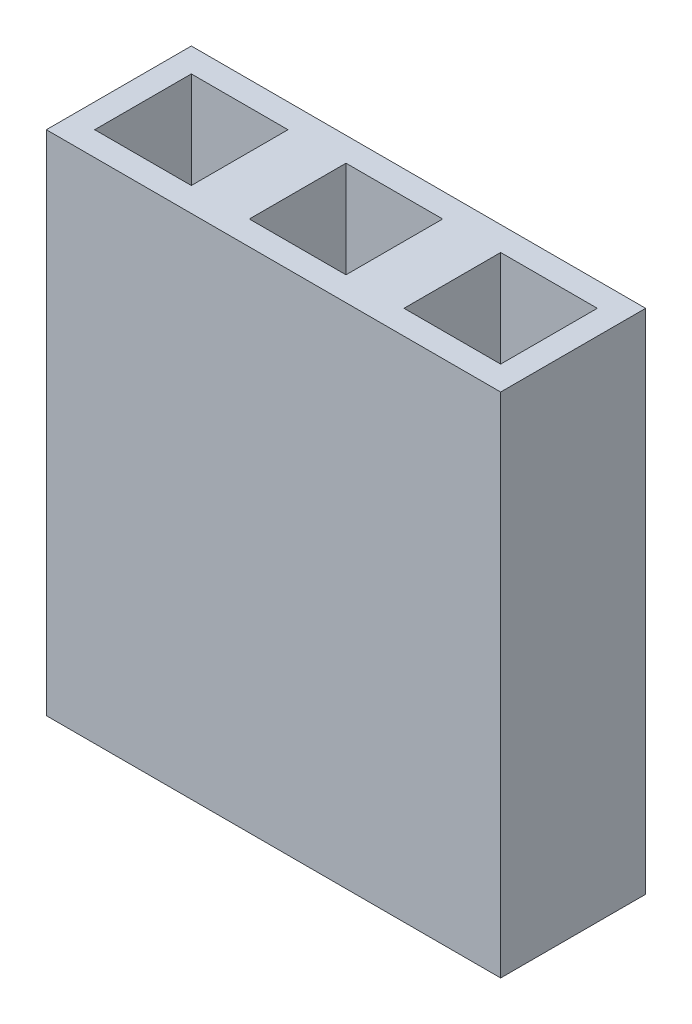
ISO-10303-21;
HEADER;
FILE_DESCRIPTION(('STEP AP214'),'2;1');
FILE_NAME('part.step','',(''),(''),'','','');
FILE_SCHEMA(('AUTOMOTIVE_DESIGN { 1 0 10303 214 1 1 1 1 }'));
ENDSEC;
DATA;
#1=APPLICATION_CONTEXT('core data for automotive mechanical design processes');
#2=APPLICATION_PROTOCOL_DEFINITION('international standard','automotive_design',2000,#1);
#3=PRODUCT_CONTEXT('',#1,'mechanical');
#4=PRODUCT('Part','Part','',(#3));
#5=PRODUCT_RELATED_PRODUCT_CATEGORY('part','',(#4));
#6=PRODUCT_DEFINITION_FORMATION('','',#4);
#7=PRODUCT_DEFINITION_CONTEXT('part definition',#1,'design');
#8=PRODUCT_DEFINITION('design','',#6,#7);
#9=PRODUCT_DEFINITION_SHAPE('','',#8);
#10=(LENGTH_UNIT() NAMED_UNIT(*) SI_UNIT(.MILLI.,.METRE.));
#11=(NAMED_UNIT(*) PLANE_ANGLE_UNIT() SI_UNIT($,.RADIAN.));
#12=(NAMED_UNIT(*) SI_UNIT($,.STERADIAN.) SOLID_ANGLE_UNIT());
#13=UNCERTAINTY_MEASURE_WITH_UNIT(LENGTH_MEASURE(1.E-05),#10,'distance_accuracy_value','');
#14=(GEOMETRIC_REPRESENTATION_CONTEXT(3) GLOBAL_UNCERTAINTY_ASSIGNED_CONTEXT((#13)) GLOBAL_UNIT_ASSIGNED_CONTEXT((#10,
#11,#12)) REPRESENTATION_CONTEXT('',''));
#15=CARTESIAN_POINT('',(0.,0.,0.));
#16=DIRECTION('',(0.,0.,1.));
#17=DIRECTION('',(1.,0.,0.));
#18=AXIS2_PLACEMENT_3D('',#15,#16,#17);
#19=CARTESIAN_POINT('',(-19.2,4.2,2.4));
#20=DIRECTION('',(0.,-1.,0.));
#21=DIRECTION('',(0.,0.,-1.));
#22=AXIS2_PLACEMENT_3D('',#19,#20,#21);
#23=PLANE('',#22);
#24=DIRECTION('',(1.,0.,0.));
#25=VECTOR('',#24,1.);
#26=CARTESIAN_POINT('',(-16.24,4.2,2.));
#27=LINE('',#26,#25);
#28=CARTESIAN_POINT('',(-16.24,4.2,2.));
#29=VERTEX_POINT('',#28);
#30=CARTESIAN_POINT('',(-14.64,4.2,2.));
#31=VERTEX_POINT('',#30);
#32=EDGE_CURVE('E226',#29,#31,#27,.T.);
#33=ORIENTED_EDGE('',*,*,#32,.F.);
#34=DIRECTION('',(0.,0.,1.));
#35=VECTOR('',#34,1.);
#36=CARTESIAN_POINT('',(-16.24,4.2,0.4));
#37=LINE('',#36,#35);
#38=CARTESIAN_POINT('',(-16.24,4.2,0.4));
#39=VERTEX_POINT('',#38);
#40=EDGE_CURVE('E57',#39,#29,#37,.T.);
#41=ORIENTED_EDGE('',*,*,#40,.F.);
#42=DIRECTION('',(-1.,0.,0.));
#43=VECTOR('',#42,1.);
#44=CARTESIAN_POINT('',(-16.24,4.2,0.4));
#45=LINE('',#44,#43);
#46=CARTESIAN_POINT('',(-14.64,4.2,0.4));
#47=VERTEX_POINT('',#46);
#48=EDGE_CURVE('E215',#47,#39,#45,.T.);
#49=ORIENTED_EDGE('',*,*,#48,.F.);
#50=DIRECTION('',(0.,0.,-1.));
#51=VECTOR('',#50,1.);
#52=CARTESIAN_POINT('',(-14.64,4.2,0.4));
#53=LINE('',#52,#51);
#54=EDGE_CURVE('E230',#31,#47,#53,.T.);
#55=ORIENTED_EDGE('',*,*,#54,.F.);
#56=EDGE_LOOP('',(#33,#41,#49,#55));
#57=FACE_BOUND('',#56,.T.);
#58=DIRECTION('',(1.,0.,0.));
#59=VECTOR('',#58,1.);
#60=CARTESIAN_POINT('',(-13.68,4.2,2.));
#61=LINE('',#60,#59);
#62=CARTESIAN_POINT('',(-13.68,4.2,2.));
#63=VERTEX_POINT('',#62);
#64=CARTESIAN_POINT('',(-12.08,4.2,2.));
#65=VERTEX_POINT('',#64);
#66=EDGE_CURVE('E258',#63,#65,#61,.T.);
#67=ORIENTED_EDGE('',*,*,#66,.F.);
#68=DIRECTION('',(0.,0.,1.));
#69=VECTOR('',#68,1.);
#70=CARTESIAN_POINT('',(-13.68,4.2,0.4));
#71=LINE('',#70,#69);
#72=CARTESIAN_POINT('',(-13.68,4.2,0.4));
#73=VERTEX_POINT('',#72);
#74=EDGE_CURVE('E208',#73,#63,#71,.T.);
#75=ORIENTED_EDGE('',*,*,#74,.F.);
#76=DIRECTION('',(-1.,0.,0.));
#77=VECTOR('',#76,1.);
#78=CARTESIAN_POINT('',(-13.68,4.2,0.4));
#79=LINE('',#78,#77);
#80=CARTESIAN_POINT('',(-12.08,4.2,0.4));
#81=VERTEX_POINT('',#80);
#82=EDGE_CURVE('E247',#81,#73,#79,.T.);
#83=ORIENTED_EDGE('',*,*,#82,.F.);
#84=DIRECTION('',(0.,0.,-1.));
#85=VECTOR('',#84,1.);
#86=CARTESIAN_POINT('',(-12.08,4.2,0.4));
#87=LINE('',#86,#85);
#88=EDGE_CURVE('E261',#65,#81,#87,.T.);
#89=ORIENTED_EDGE('',*,*,#88,.F.);
#90=EDGE_LOOP('',(#67,#75,#83,#89));
#91=FACE_BOUND('',#90,.T.);
#92=DIRECTION('',(1.,0.,0.));
#93=VECTOR('',#92,1.);
#94=CARTESIAN_POINT('',(-18.8,4.2,2.));
#95=LINE('',#94,#93);
#96=CARTESIAN_POINT('',(-18.8,4.2,2.));
#97=VERTEX_POINT('',#96);
#98=CARTESIAN_POINT('',(-17.2,4.2,2.));
#99=VERTEX_POINT('',#98);
#100=EDGE_CURVE('E287',#97,#99,#95,.T.);
#101=ORIENTED_EDGE('',*,*,#100,.F.);
#102=DIRECTION('',(0.,0.,1.));
#103=VECTOR('',#102,1.);
#104=CARTESIAN_POINT('',(-18.8,4.2,0.4));
#105=LINE('',#104,#103);
#106=CARTESIAN_POINT('',(-18.8,4.2,0.4));
#107=VERTEX_POINT('',#106);
#108=EDGE_CURVE('E237',#107,#97,#105,.T.);
#109=ORIENTED_EDGE('',*,*,#108,.F.);
#110=DIRECTION('',(-1.,0.,0.));
#111=VECTOR('',#110,1.);
#112=CARTESIAN_POINT('',(-18.8,4.2,0.4));
#113=LINE('',#112,#111);
#114=CARTESIAN_POINT('',(-17.2,4.2,0.4));
#115=VERTEX_POINT('',#114);
#116=EDGE_CURVE('E277',#115,#107,#113,.T.);
#117=ORIENTED_EDGE('',*,*,#116,.F.);
#118=DIRECTION('',(0.,0.,-1.));
#119=VECTOR('',#118,1.);
#120=CARTESIAN_POINT('',(-17.2,4.2,0.4));
#121=LINE('',#120,#119);
#122=EDGE_CURVE('E290',#99,#115,#121,.T.);
#123=ORIENTED_EDGE('',*,*,#122,.F.);
#124=EDGE_LOOP('',(#101,#109,#117,#123));
#125=FACE_BOUND('',#124,.T.);
#126=DIRECTION('',(-1.,0.,0.));
#127=VECTOR('',#126,1.);
#128=CARTESIAN_POINT('',(-19.2,4.2,2.4));
#129=LINE('',#128,#127);
#130=CARTESIAN_POINT('',(-11.68,4.2,2.4));
#131=VERTEX_POINT('',#130);
#132=CARTESIAN_POINT('',(-19.2,4.2,2.4));
#133=VERTEX_POINT('',#132);
#134=EDGE_CURVE('E156',#131,#133,#129,.T.);
#135=ORIENTED_EDGE('',*,*,#134,.F.);
#136=DIRECTION('',(0.,0.,1.));
#137=VECTOR('',#136,1.);
#138=CARTESIAN_POINT('',(-11.68,4.2,-7.6));
#139=LINE('',#138,#137);
#140=CARTESIAN_POINT('',(-11.68,4.2,0.));
#141=VERTEX_POINT('',#140);
#142=EDGE_CURVE('E145',#141,#131,#139,.T.);
#143=ORIENTED_EDGE('',*,*,#142,.F.);
#144=DIRECTION('',(-1.,0.,0.));
#145=VECTOR('',#144,1.);
#146=CARTESIAN_POINT('',(-19.2,4.2,0.));
#147=LINE('',#146,#145);
#148=CARTESIAN_POINT('',(-19.2,4.2,0.));
#149=VERTEX_POINT('',#148);
#150=EDGE_CURVE('E176',#141,#149,#147,.T.);
#151=ORIENTED_EDGE('',*,*,#150,.T.);
#152=DIRECTION('',(0.,0.,-1.));
#153=VECTOR('',#152,1.);
#154=CARTESIAN_POINT('',(-19.2,4.2,2.4));
#155=LINE('',#154,#153);
#156=EDGE_CURVE('E43',#133,#149,#155,.T.);
#157=ORIENTED_EDGE('',*,*,#156,.F.);
#158=EDGE_LOOP('',(#135,#143,#151,#157));
#159=FACE_BOUND('',#158,.T.);
#160=ADVANCED_FACE('F36',(#57,#91,#125,#159),#23,.F.);
#161=CARTESIAN_POINT('',(-19.2,4.2,2.4));
#162=DIRECTION('',(1.,0.,0.));
#163=DIRECTION('',(0.,0.,-1.));
#164=AXIS2_PLACEMENT_3D('',#161,#162,#163);
#165=PLANE('',#164);
#166=DIRECTION('',(0.,-1.,0.));
#167=VECTOR('',#166,1.);
#168=CARTESIAN_POINT('',(-19.2,4.2,0.));
#169=LINE('',#168,#167);
#170=CARTESIAN_POINT('',(-19.2,-4.2,0.));
#171=VERTEX_POINT('',#170);
#172=EDGE_CURVE('E168',#149,#171,#169,.T.);
#173=ORIENTED_EDGE('',*,*,#172,.T.);
#174=DIRECTION('',(0.,0.,-1.));
#175=VECTOR('',#174,1.);
#176=CARTESIAN_POINT('',(-19.2,-4.2,2.4));
#177=LINE('',#176,#175);
#178=CARTESIAN_POINT('',(-19.2,-4.2,2.4));
#179=VERTEX_POINT('',#178);
#180=EDGE_CURVE('E175',#179,#171,#177,.T.);
#181=ORIENTED_EDGE('',*,*,#180,.F.);
#182=DIRECTION('',(0.,-1.,0.));
#183=VECTOR('',#182,1.);
#184=CARTESIAN_POINT('',(-19.2,4.2,2.4));
#185=LINE('',#184,#183);
#186=EDGE_CURVE('E163',#133,#179,#185,.T.);
#187=ORIENTED_EDGE('',*,*,#186,.F.);
#188=ORIENTED_EDGE('',*,*,#156,.T.);
#189=EDGE_LOOP('',(#173,#181,#187,#188));
#190=FACE_BOUND('',#189,.T.);
#191=ADVANCED_FACE('F183',(#190),#165,.F.);
#192=CARTESIAN_POINT('',(-19.2,-4.2,2.4));
#193=DIRECTION('',(0.,1.,0.));
#194=DIRECTION('',(0.,0.,1.));
#195=AXIS2_PLACEMENT_3D('',#192,#193,#194);
#196=PLANE('',#195);
#197=CARTESIAN_POINT('',(-15.457,-4.2,1.2));
#198=DIRECTION('',(0.,1.,0.));
#199=DIRECTION('',(0.,0.,1.));
#200=AXIS2_PLACEMENT_3D('',#197,#198,#199);
#201=CIRCLE('',#200,0.509999999999999);
#202=CARTESIAN_POINT('',(-15.457,-4.2,1.71));
#203=VERTEX_POINT('',#202);
#204=EDGE_CURVE('E196',#203,#203,#201,.T.);
#205=ORIENTED_EDGE('',*,*,#204,.T.);
#206=EDGE_LOOP('',(#205));
#207=FACE_BOUND('',#206,.T.);
#208=CARTESIAN_POINT('',(-12.914,-4.2,1.2));
#209=DIRECTION('',(0.,1.,0.));
#210=DIRECTION('',(0.,0.,1.));
#211=AXIS2_PLACEMENT_3D('',#208,#209,#210);
#212=CIRCLE('',#211,0.509999999999999);
#213=CARTESIAN_POINT('',(-12.914,-4.2,1.71));
#214=VERTEX_POINT('',#213);
#215=EDGE_CURVE('E193',#214,#214,#212,.T.);
#216=ORIENTED_EDGE('',*,*,#215,.T.);
#217=EDGE_LOOP('',(#216));
#218=FACE_BOUND('',#217,.T.);
#219=CARTESIAN_POINT('',(-18.,-4.2,1.2));
#220=DIRECTION('',(0.,1.,0.));
#221=DIRECTION('',(0.,0.,1.));
#222=AXIS2_PLACEMENT_3D('',#219,#220,#221);
#223=CIRCLE('',#222,0.509999999999999);
#224=CARTESIAN_POINT('',(-18.,-4.2,1.71));
#225=VERTEX_POINT('',#224);
#226=EDGE_CURVE('E205',#225,#225,#223,.T.);
#227=ORIENTED_EDGE('',*,*,#226,.T.);
#228=EDGE_LOOP('',(#227));
#229=FACE_BOUND('',#228,.T.);
#230=DIRECTION('',(1.,0.,0.));
#231=VECTOR('',#230,1.);
#232=CARTESIAN_POINT('',(-19.2,-4.2,0.));
#233=LINE('',#232,#231);
#234=CARTESIAN_POINT('',(-11.68,-4.2,0.));
#235=VERTEX_POINT('',#234);
#236=EDGE_CURVE('E164',#171,#235,#233,.T.);
#237=ORIENTED_EDGE('',*,*,#236,.T.);
#238=DIRECTION('',(0.,0.,1.));
#239=VECTOR('',#238,1.);
#240=CARTESIAN_POINT('',(-11.68,-4.2,-7.6));
#241=LINE('',#240,#239);
#242=CARTESIAN_POINT('',(-11.68,-4.2,2.4));
#243=VERTEX_POINT('',#242);
#244=EDGE_CURVE('E50',#235,#243,#241,.T.);
#245=ORIENTED_EDGE('',*,*,#244,.T.);
#246=DIRECTION('',(1.,0.,0.));
#247=VECTOR('',#246,1.);
#248=CARTESIAN_POINT('',(-19.2,-4.2,2.4));
#249=LINE('',#248,#247);
#250=EDGE_CURVE('E159',#179,#243,#249,.T.);
#251=ORIENTED_EDGE('',*,*,#250,.F.);
#252=ORIENTED_EDGE('',*,*,#180,.T.);
#253=EDGE_LOOP('',(#237,#245,#251,#252));
#254=FACE_BOUND('',#253,.T.);
#255=ADVANCED_FACE('F189',(#207,#218,#229,#254),#196,.F.);
#256=CARTESIAN_POINT('',(0.,0.,2.4));
#257=DIRECTION('',(0.,0.,1.));
#258=DIRECTION('',(1.,0.,0.));
#259=AXIS2_PLACEMENT_3D('',#256,#257,#258);
#260=PLANE('',#259);
#261=DIRECTION('',(0.,-1.,0.));
#262=VECTOR('',#261,1.);
#263=CARTESIAN_POINT('',(-11.68,4.2,2.4));
#264=LINE('',#263,#262);
#265=EDGE_CURVE('E148',#131,#243,#264,.T.);
#266=ORIENTED_EDGE('',*,*,#265,.F.);
#267=ORIENTED_EDGE('',*,*,#134,.T.);
#268=ORIENTED_EDGE('',*,*,#186,.T.);
#269=ORIENTED_EDGE('',*,*,#250,.T.);
#270=EDGE_LOOP('',(#266,#267,#268,#269));
#271=FACE_BOUND('',#270,.T.);
#272=ADVANCED_FACE('F155',(#271),#260,.T.);
#273=CARTESIAN_POINT('',(0.,0.,0.));
#274=DIRECTION('',(0.,0.,1.));
#275=DIRECTION('',(1.,0.,0.));
#276=AXIS2_PLACEMENT_3D('',#273,#274,#275);
#277=PLANE('',#276);
#278=ORIENTED_EDGE('',*,*,#150,.F.);
#279=DIRECTION('',(0.,-1.,0.));
#280=VECTOR('',#279,1.);
#281=CARTESIAN_POINT('',(-11.68,0.,0.));
#282=LINE('',#281,#280);
#283=EDGE_CURVE('E11',#141,#235,#282,.T.);
#284=ORIENTED_EDGE('',*,*,#283,.T.);
#285=ORIENTED_EDGE('',*,*,#236,.F.);
#286=ORIENTED_EDGE('',*,*,#172,.F.);
#287=EDGE_LOOP('',(#278,#284,#285,#286));
#288=FACE_BOUND('',#287,.T.);
#289=ADVANCED_FACE('F187',(#288),#277,.F.);
#290=CARTESIAN_POINT('',(-18.8,1.7,0.4));
#291=DIRECTION('',(-1.,0.,0.));
#292=DIRECTION('',(0.,0.,1.));
#293=AXIS2_PLACEMENT_3D('',#290,#291,#292);
#294=PLANE('',#293);
#295=ORIENTED_EDGE('',*,*,#108,.T.);
#296=DIRECTION('',(0.,1.,0.));
#297=VECTOR('',#296,1.);
#298=CARTESIAN_POINT('',(-18.8,1.7,2.));
#299=LINE('',#298,#297);
#300=CARTESIAN_POINT('',(-18.8,1.7,2.));
#301=VERTEX_POINT('',#300);
#302=EDGE_CURVE('E171',#301,#97,#299,.T.);
#303=ORIENTED_EDGE('',*,*,#302,.F.);
#304=DIRECTION('',(0.,0.,1.));
#305=VECTOR('',#304,1.);
#306=CARTESIAN_POINT('',(-18.8,1.7,0.4));
#307=LINE('',#306,#305);
#308=CARTESIAN_POINT('',(-18.8,1.7,0.4));
#309=VERTEX_POINT('',#308);
#310=EDGE_CURVE('E273',#309,#301,#307,.T.);
#311=ORIENTED_EDGE('',*,*,#310,.F.);
#312=DIRECTION('',(0.,1.,0.));
#313=VECTOR('',#312,1.);
#314=CARTESIAN_POINT('',(-18.8,1.7,0.4));
#315=LINE('',#314,#313);
#316=EDGE_CURVE('E178',#309,#107,#315,.T.);
#317=ORIENTED_EDGE('',*,*,#316,.T.);
#318=EDGE_LOOP('',(#295,#303,#311,#317));
#319=FACE_BOUND('',#318,.T.);
#320=ADVANCED_FACE('F317',(#319),#294,.F.);
#321=CARTESIAN_POINT('',(-18.8,1.7,0.4));
#322=DIRECTION('',(0.,0.,-1.));
#323=DIRECTION('',(-1.,0.,0.));
#324=AXIS2_PLACEMENT_3D('',#321,#322,#323);
#325=PLANE('',#324);
#326=ORIENTED_EDGE('',*,*,#116,.T.);
#327=ORIENTED_EDGE('',*,*,#316,.F.);
#328=DIRECTION('',(-1.,0.,0.));
#329=VECTOR('',#328,1.);
#330=CARTESIAN_POINT('',(-18.8,1.7,0.4));
#331=LINE('',#330,#329);
#332=CARTESIAN_POINT('',(-17.2,1.7,0.4));
#333=VERTEX_POINT('',#332);
#334=EDGE_CURVE('E283',#333,#309,#331,.T.);
#335=ORIENTED_EDGE('',*,*,#334,.F.);
#336=DIRECTION('',(0.,1.,0.));
#337=VECTOR('',#336,1.);
#338=CARTESIAN_POINT('',(-17.2,1.7,0.4));
#339=LINE('',#338,#337);
#340=EDGE_CURVE('E296',#333,#115,#339,.T.);
#341=ORIENTED_EDGE('',*,*,#340,.T.);
#342=EDGE_LOOP('',(#326,#327,#335,#341));
#343=FACE_BOUND('',#342,.T.);
#344=ADVANCED_FACE('F316',(#343),#325,.F.);
#345=CARTESIAN_POINT('',(-17.2,1.7,0.4));
#346=DIRECTION('',(1.,0.,0.));
#347=DIRECTION('',(0.,0.,-1.));
#348=AXIS2_PLACEMENT_3D('',#345,#346,#347);
#349=PLANE('',#348);
#350=ORIENTED_EDGE('',*,*,#122,.T.);
#351=ORIENTED_EDGE('',*,*,#340,.F.);
#352=DIRECTION('',(0.,0.,-1.));
#353=VECTOR('',#352,1.);
#354=CARTESIAN_POINT('',(-17.2,1.7,0.4));
#355=LINE('',#354,#353);
#356=CARTESIAN_POINT('',(-17.2,1.7,2.));
#357=VERTEX_POINT('',#356);
#358=EDGE_CURVE('E280',#357,#333,#355,.T.);
#359=ORIENTED_EDGE('',*,*,#358,.F.);
#360=DIRECTION('',(0.,1.,0.));
#361=VECTOR('',#360,1.);
#362=CARTESIAN_POINT('',(-17.2,1.7,2.));
#363=LINE('',#362,#361);
#364=EDGE_CURVE('E297',#357,#99,#363,.T.);
#365=ORIENTED_EDGE('',*,*,#364,.T.);
#366=EDGE_LOOP('',(#350,#351,#359,#365));
#367=FACE_BOUND('',#366,.T.);
#368=ADVANCED_FACE('F311',(#367),#349,.F.);
#369=CARTESIAN_POINT('',(-18.8,1.7,2.));
#370=DIRECTION('',(0.,0.,1.));
#371=DIRECTION('',(1.,0.,0.));
#372=AXIS2_PLACEMENT_3D('',#369,#370,#371);
#373=PLANE('',#372);
#374=ORIENTED_EDGE('',*,*,#100,.T.);
#375=ORIENTED_EDGE('',*,*,#364,.F.);
#376=DIRECTION('',(1.,0.,0.));
#377=VECTOR('',#376,1.);
#378=CARTESIAN_POINT('',(-18.8,1.7,2.));
#379=LINE('',#378,#377);
#380=EDGE_CURVE('E276',#301,#357,#379,.T.);
#381=ORIENTED_EDGE('',*,*,#380,.F.);
#382=ORIENTED_EDGE('',*,*,#302,.T.);
#383=EDGE_LOOP('',(#374,#375,#381,#382));
#384=FACE_BOUND('',#383,.T.);
#385=ADVANCED_FACE('F304',(#384),#373,.F.);
#386=CARTESIAN_POINT('',(0.,1.7,0.));
#387=DIRECTION('',(0.,1.,0.));
#388=DIRECTION('',(0.,0.,1.));
#389=AXIS2_PLACEMENT_3D('',#386,#387,#388);
#390=PLANE('',#389);
#391=CARTESIAN_POINT('',(-18.,1.7,1.2));
#392=DIRECTION('',(0.,1.,0.));
#393=DIRECTION('',(0.,0.,1.));
#394=AXIS2_PLACEMENT_3D('',#391,#392,#393);
#395=CIRCLE('',#394,0.509999999999999);
#396=CARTESIAN_POINT('',(-18.,1.7,1.71));
#397=VERTEX_POINT('',#396);
#398=EDGE_CURVE('E199',#397,#397,#395,.T.);
#399=ORIENTED_EDGE('',*,*,#398,.F.);
#400=EDGE_LOOP('',(#399));
#401=FACE_BOUND('',#400,.T.);
#402=ORIENTED_EDGE('',*,*,#310,.T.);
#403=ORIENTED_EDGE('',*,*,#380,.T.);
#404=ORIENTED_EDGE('',*,*,#358,.T.);
#405=ORIENTED_EDGE('',*,*,#334,.T.);
#406=EDGE_LOOP('',(#402,#403,#404,#405));
#407=FACE_BOUND('',#406,.T.);
#408=ADVANCED_FACE('F315',(#401,#407),#390,.T.);
#409=CARTESIAN_POINT('',(-13.68,1.7,0.4));
#410=DIRECTION('',(-1.,0.,0.));
#411=DIRECTION('',(0.,0.,1.));
#412=AXIS2_PLACEMENT_3D('',#409,#410,#411);
#413=PLANE('',#412);
#414=ORIENTED_EDGE('',*,*,#74,.T.);
#415=DIRECTION('',(0.,1.,0.));
#416=VECTOR('',#415,1.);
#417=CARTESIAN_POINT('',(-13.68,1.7,2.));
#418=LINE('',#417,#416);
#419=CARTESIAN_POINT('',(-13.68,1.7,2.));
#420=VERTEX_POINT('',#419);
#421=EDGE_CURVE('E256',#420,#63,#418,.T.);
#422=ORIENTED_EDGE('',*,*,#421,.F.);
#423=DIRECTION('',(0.,0.,1.));
#424=VECTOR('',#423,1.);
#425=CARTESIAN_POINT('',(-13.68,1.7,0.4));
#426=LINE('',#425,#424);
#427=CARTESIAN_POINT('',(-13.68,1.7,0.4));
#428=VERTEX_POINT('',#427);
#429=EDGE_CURVE('E243',#428,#420,#426,.T.);
#430=ORIENTED_EDGE('',*,*,#429,.F.);
#431=DIRECTION('',(0.,1.,0.));
#432=VECTOR('',#431,1.);
#433=CARTESIAN_POINT('',(-13.68,1.7,0.4));
#434=LINE('',#433,#432);
#435=EDGE_CURVE('E227',#428,#73,#434,.T.);
#436=ORIENTED_EDGE('',*,*,#435,.T.);
#437=EDGE_LOOP('',(#414,#422,#430,#436));
#438=FACE_BOUND('',#437,.T.);
#439=ADVANCED_FACE('F349',(#438),#413,.F.);
#440=CARTESIAN_POINT('',(-13.68,1.7,0.4));
#441=DIRECTION('',(0.,0.,-1.));
#442=DIRECTION('',(-1.,0.,0.));
#443=AXIS2_PLACEMENT_3D('',#440,#441,#442);
#444=PLANE('',#443);
#445=ORIENTED_EDGE('',*,*,#82,.T.);
#446=ORIENTED_EDGE('',*,*,#435,.F.);
#447=DIRECTION('',(-1.,0.,0.));
#448=VECTOR('',#447,1.);
#449=CARTESIAN_POINT('',(-13.68,1.7,0.4));
#450=LINE('',#449,#448);
#451=CARTESIAN_POINT('',(-12.08,1.7,0.4));
#452=VERTEX_POINT('',#451);
#453=EDGE_CURVE('E253',#452,#428,#450,.T.);
#454=ORIENTED_EDGE('',*,*,#453,.F.);
#455=DIRECTION('',(0.,1.,0.));
#456=VECTOR('',#455,1.);
#457=CARTESIAN_POINT('',(-12.08,1.7,0.4));
#458=LINE('',#457,#456);
#459=EDGE_CURVE('E267',#452,#81,#458,.T.);
#460=ORIENTED_EDGE('',*,*,#459,.T.);
#461=EDGE_LOOP('',(#445,#446,#454,#460));
#462=FACE_BOUND('',#461,.T.);
#463=ADVANCED_FACE('F352',(#462),#444,.F.);
#464=CARTESIAN_POINT('',(-12.08,1.7,0.4));
#465=DIRECTION('',(1.,0.,0.));
#466=DIRECTION('',(0.,0.,-1.));
#467=AXIS2_PLACEMENT_3D('',#464,#465,#466);
#468=PLANE('',#467);
#469=ORIENTED_EDGE('',*,*,#88,.T.);
#470=ORIENTED_EDGE('',*,*,#459,.F.);
#471=DIRECTION('',(0.,0.,-1.));
#472=VECTOR('',#471,1.);
#473=CARTESIAN_POINT('',(-12.08,1.7,0.4));
#474=LINE('',#473,#472);
#475=CARTESIAN_POINT('',(-12.08,1.7,2.));
#476=VERTEX_POINT('',#475);
#477=EDGE_CURVE('E250',#476,#452,#474,.T.);
#478=ORIENTED_EDGE('',*,*,#477,.F.);
#479=DIRECTION('',(0.,1.,0.));
#480=VECTOR('',#479,1.);
#481=CARTESIAN_POINT('',(-12.08,1.7,2.));
#482=LINE('',#481,#480);
#483=EDGE_CURVE('E269',#476,#65,#482,.T.);
#484=ORIENTED_EDGE('',*,*,#483,.T.);
#485=EDGE_LOOP('',(#469,#470,#478,#484));
#486=FACE_BOUND('',#485,.T.);
#487=ADVANCED_FACE('F354',(#486),#468,.F.);
#488=CARTESIAN_POINT('',(-13.68,1.7,2.));
#489=DIRECTION('',(0.,0.,1.));
#490=DIRECTION('',(1.,0.,0.));
#491=AXIS2_PLACEMENT_3D('',#488,#489,#490);
#492=PLANE('',#491);
#493=ORIENTED_EDGE('',*,*,#66,.T.);
#494=ORIENTED_EDGE('',*,*,#483,.F.);
#495=DIRECTION('',(1.,0.,0.));
#496=VECTOR('',#495,1.);
#497=CARTESIAN_POINT('',(-13.68,1.7,2.));
#498=LINE('',#497,#496);
#499=EDGE_CURVE('E246',#420,#476,#498,.T.);
#500=ORIENTED_EDGE('',*,*,#499,.F.);
#501=ORIENTED_EDGE('',*,*,#421,.T.);
#502=EDGE_LOOP('',(#493,#494,#500,#501));
#503=FACE_BOUND('',#502,.T.);
#504=ADVANCED_FACE('F344',(#503),#492,.F.);
#505=CARTESIAN_POINT('',(5.12,1.7,0.));
#506=DIRECTION('',(0.,1.,0.));
#507=DIRECTION('',(0.,0.,1.));
#508=AXIS2_PLACEMENT_3D('',#505,#506,#507);
#509=PLANE('',#508);
#510=CARTESIAN_POINT('',(-12.914,1.7,1.2));
#511=DIRECTION('',(0.,1.,0.));
#512=DIRECTION('',(0.,0.,1.));
#513=AXIS2_PLACEMENT_3D('',#510,#511,#512);
#514=CIRCLE('',#513,0.509999999999999);
#515=CARTESIAN_POINT('',(-12.914,1.7,1.71));
#516=VERTEX_POINT('',#515);
#517=EDGE_CURVE('E190',#516,#516,#514,.T.);
#518=ORIENTED_EDGE('',*,*,#517,.F.);
#519=EDGE_LOOP('',(#518));
#520=FACE_BOUND('',#519,.T.);
#521=ORIENTED_EDGE('',*,*,#429,.T.);
#522=ORIENTED_EDGE('',*,*,#499,.T.);
#523=ORIENTED_EDGE('',*,*,#477,.T.);
#524=ORIENTED_EDGE('',*,*,#453,.T.);
#525=EDGE_LOOP('',(#521,#522,#523,#524));
#526=FACE_BOUND('',#525,.T.);
#527=ADVANCED_FACE('F356',(#520,#526),#509,.T.);
#528=CARTESIAN_POINT('',(-16.24,1.7,0.4));
#529=DIRECTION('',(-1.,0.,0.));
#530=DIRECTION('',(0.,0.,1.));
#531=AXIS2_PLACEMENT_3D('',#528,#529,#530);
#532=PLANE('',#531);
#533=ORIENTED_EDGE('',*,*,#40,.T.);
#534=DIRECTION('',(0.,1.,0.));
#535=VECTOR('',#534,1.);
#536=CARTESIAN_POINT('',(-16.24,1.7,2.));
#537=LINE('',#536,#535);
#538=CARTESIAN_POINT('',(-16.24,1.7,2.));
#539=VERTEX_POINT('',#538);
#540=EDGE_CURVE('E224',#539,#29,#537,.T.);
#541=ORIENTED_EDGE('',*,*,#540,.F.);
#542=DIRECTION('',(0.,0.,1.));
#543=VECTOR('',#542,1.);
#544=CARTESIAN_POINT('',(-16.24,1.7,0.4));
#545=LINE('',#544,#543);
#546=CARTESIAN_POINT('',(-16.24,1.7,0.4));
#547=VERTEX_POINT('',#546);
#548=EDGE_CURVE('E211',#547,#539,#545,.T.);
#549=ORIENTED_EDGE('',*,*,#548,.F.);
#550=DIRECTION('',(0.,1.,0.));
#551=VECTOR('',#550,1.);
#552=CARTESIAN_POINT('',(-16.24,1.7,0.4));
#553=LINE('',#552,#551);
#554=EDGE_CURVE('E235',#547,#39,#553,.T.);
#555=ORIENTED_EDGE('',*,*,#554,.T.);
#556=EDGE_LOOP('',(#533,#541,#549,#555));
#557=FACE_BOUND('',#556,.T.);
#558=ADVANCED_FACE('F358',(#557),#532,.F.);
#559=CARTESIAN_POINT('',(-16.24,1.7,0.4));
#560=DIRECTION('',(0.,0.,-1.));
#561=DIRECTION('',(-1.,0.,0.));
#562=AXIS2_PLACEMENT_3D('',#559,#560,#561);
#563=PLANE('',#562);
#564=ORIENTED_EDGE('',*,*,#48,.T.);
#565=ORIENTED_EDGE('',*,*,#554,.F.);
#566=DIRECTION('',(-1.,0.,0.));
#567=VECTOR('',#566,1.);
#568=CARTESIAN_POINT('',(-16.24,1.7,0.4));
#569=LINE('',#568,#567);
#570=CARTESIAN_POINT('',(-14.64,1.7,0.4));
#571=VERTEX_POINT('',#570);
#572=EDGE_CURVE('E221',#571,#547,#569,.T.);
#573=ORIENTED_EDGE('',*,*,#572,.F.);
#574=DIRECTION('',(0.,1.,0.));
#575=VECTOR('',#574,1.);
#576=CARTESIAN_POINT('',(-14.64,1.7,0.4));
#577=LINE('',#576,#575);
#578=EDGE_CURVE('E238',#571,#47,#577,.T.);
#579=ORIENTED_EDGE('',*,*,#578,.T.);
#580=EDGE_LOOP('',(#564,#565,#573,#579));
#581=FACE_BOUND('',#580,.T.);
#582=ADVANCED_FACE('F365',(#581),#563,.F.);
#583=CARTESIAN_POINT('',(-14.64,1.7,0.4));
#584=DIRECTION('',(1.,0.,0.));
#585=DIRECTION('',(0.,0.,-1.));
#586=AXIS2_PLACEMENT_3D('',#583,#584,#585);
#587=PLANE('',#586);
#588=ORIENTED_EDGE('',*,*,#54,.T.);
#589=ORIENTED_EDGE('',*,*,#578,.F.);
#590=DIRECTION('',(0.,0.,-1.));
#591=VECTOR('',#590,1.);
#592=CARTESIAN_POINT('',(-14.64,1.7,0.4));
#593=LINE('',#592,#591);
#594=CARTESIAN_POINT('',(-14.64,1.7,2.));
#595=VERTEX_POINT('',#594);
#596=EDGE_CURVE('E218',#595,#571,#593,.T.);
#597=ORIENTED_EDGE('',*,*,#596,.F.);
#598=DIRECTION('',(0.,1.,0.));
#599=VECTOR('',#598,1.);
#600=CARTESIAN_POINT('',(-14.64,1.7,2.));
#601=LINE('',#600,#599);
#602=EDGE_CURVE('E240',#595,#31,#601,.T.);
#603=ORIENTED_EDGE('',*,*,#602,.T.);
#604=EDGE_LOOP('',(#588,#589,#597,#603));
#605=FACE_BOUND('',#604,.T.);
#606=ADVANCED_FACE('F424',(#605),#587,.F.);
#607=CARTESIAN_POINT('',(-16.24,1.7,2.));
#608=DIRECTION('',(0.,0.,1.));
#609=DIRECTION('',(1.,0.,0.));
#610=AXIS2_PLACEMENT_3D('',#607,#608,#609);
#611=PLANE('',#610);
#612=ORIENTED_EDGE('',*,*,#32,.T.);
#613=ORIENTED_EDGE('',*,*,#602,.F.);
#614=DIRECTION('',(1.,0.,0.));
#615=VECTOR('',#614,1.);
#616=CARTESIAN_POINT('',(-16.24,1.7,2.));
#617=LINE('',#616,#615);
#618=EDGE_CURVE('E214',#539,#595,#617,.T.);
#619=ORIENTED_EDGE('',*,*,#618,.F.);
#620=ORIENTED_EDGE('',*,*,#540,.T.);
#621=EDGE_LOOP('',(#612,#613,#619,#620));
#622=FACE_BOUND('',#621,.T.);
#623=ADVANCED_FACE('F433',(#622),#611,.F.);
#624=CARTESIAN_POINT('',(2.56,1.7,0.));
#625=DIRECTION('',(0.,1.,0.));
#626=DIRECTION('',(0.,0.,1.));
#627=AXIS2_PLACEMENT_3D('',#624,#625,#626);
#628=PLANE('',#627);
#629=CARTESIAN_POINT('',(-15.457,1.7,1.2));
#630=DIRECTION('',(0.,1.,0.));
#631=DIRECTION('',(0.,0.,1.));
#632=AXIS2_PLACEMENT_3D('',#629,#630,#631);
#633=CIRCLE('',#632,0.509999999999999);
#634=CARTESIAN_POINT('',(-15.457,1.7,1.71));
#635=VERTEX_POINT('',#634);
#636=EDGE_CURVE('E200',#635,#635,#633,.T.);
#637=ORIENTED_EDGE('',*,*,#636,.F.);
#638=EDGE_LOOP('',(#637));
#639=FACE_BOUND('',#638,.T.);
#640=ORIENTED_EDGE('',*,*,#548,.T.);
#641=ORIENTED_EDGE('',*,*,#618,.T.);
#642=ORIENTED_EDGE('',*,*,#596,.T.);
#643=ORIENTED_EDGE('',*,*,#572,.T.);
#644=EDGE_LOOP('',(#640,#641,#642,#643));
#645=FACE_BOUND('',#644,.T.);
#646=ADVANCED_FACE('F442',(#639,#645),#628,.T.);
#647=CARTESIAN_POINT('',(-18.,-4.2,1.2));
#648=DIRECTION('',(0.,1.,0.));
#649=DIRECTION('',(0.,0.,1.));
#650=AXIS2_PLACEMENT_3D('',#647,#648,#649);
#651=CYLINDRICAL_SURFACE('',#650,0.509999999999999);
#652=ORIENTED_EDGE('',*,*,#226,.F.);
#653=EDGE_LOOP('',(#652));
#654=FACE_BOUND('',#653,.T.);
#655=ORIENTED_EDGE('',*,*,#398,.T.);
#656=EDGE_LOOP('',(#655));
#657=FACE_BOUND('',#656,.T.);
#658=ADVANCED_FACE('F452',(#654,#657),#651,.F.);
#659=CARTESIAN_POINT('',(-12.914,-4.2,1.2));
#660=DIRECTION('',(0.,1.,0.));
#661=DIRECTION('',(0.,0.,1.));
#662=AXIS2_PLACEMENT_3D('',#659,#660,#661);
#663=CYLINDRICAL_SURFACE('',#662,0.509999999999999);
#664=ORIENTED_EDGE('',*,*,#215,.F.);
#665=EDGE_LOOP('',(#664));
#666=FACE_BOUND('',#665,.T.);
#667=ORIENTED_EDGE('',*,*,#517,.T.);
#668=EDGE_LOOP('',(#667));
#669=FACE_BOUND('',#668,.T.);
#670=ADVANCED_FACE('F459',(#666,#669),#663,.F.);
#671=CARTESIAN_POINT('',(-15.457,-4.2,1.2));
#672=DIRECTION('',(0.,1.,0.));
#673=DIRECTION('',(0.,0.,1.));
#674=AXIS2_PLACEMENT_3D('',#671,#672,#673);
#675=CYLINDRICAL_SURFACE('',#674,0.509999999999999);
#676=ORIENTED_EDGE('',*,*,#204,.F.);
#677=EDGE_LOOP('',(#676));
#678=FACE_BOUND('',#677,.T.);
#679=ORIENTED_EDGE('',*,*,#636,.T.);
#680=EDGE_LOOP('',(#679));
#681=FACE_BOUND('',#680,.T.);
#682=ADVANCED_FACE('F466',(#678,#681),#675,.F.);
#683=CARTESIAN_POINT('',(-11.68,4.2,-7.6));
#684=DIRECTION('',(-1.,0.,0.));
#685=DIRECTION('',(0.,0.,1.));
#686=AXIS2_PLACEMENT_3D('',#683,#684,#685);
#687=PLANE('',#686);
#688=ORIENTED_EDGE('',*,*,#142,.T.);
#689=ORIENTED_EDGE('',*,*,#265,.T.);
#690=ORIENTED_EDGE('',*,*,#244,.F.);
#691=ORIENTED_EDGE('',*,*,#283,.F.);
#692=EDGE_LOOP('',(#688,#689,#690,#691));
#693=FACE_BOUND('',#692,.T.);
#694=ADVANCED_FACE('F147',(#693),#687,.F.);
#695=CLOSED_SHELL('',(#160,#191,#255,#272,#289,#320,#344,#368,#385,#408,#439,#463,#487,#504,
#527,#558,#582,#606,#623,#646,#658,#670,#682,#694));
#696=MANIFOLD_SOLID_BREP('B2',#695);
#697=ADVANCED_BREP_SHAPE_REPRESENTATION('',(#18,#696),#14);
#698=SHAPE_DEFINITION_REPRESENTATION(#9,#697);
ENDSEC;
END-ISO-10303-21;
